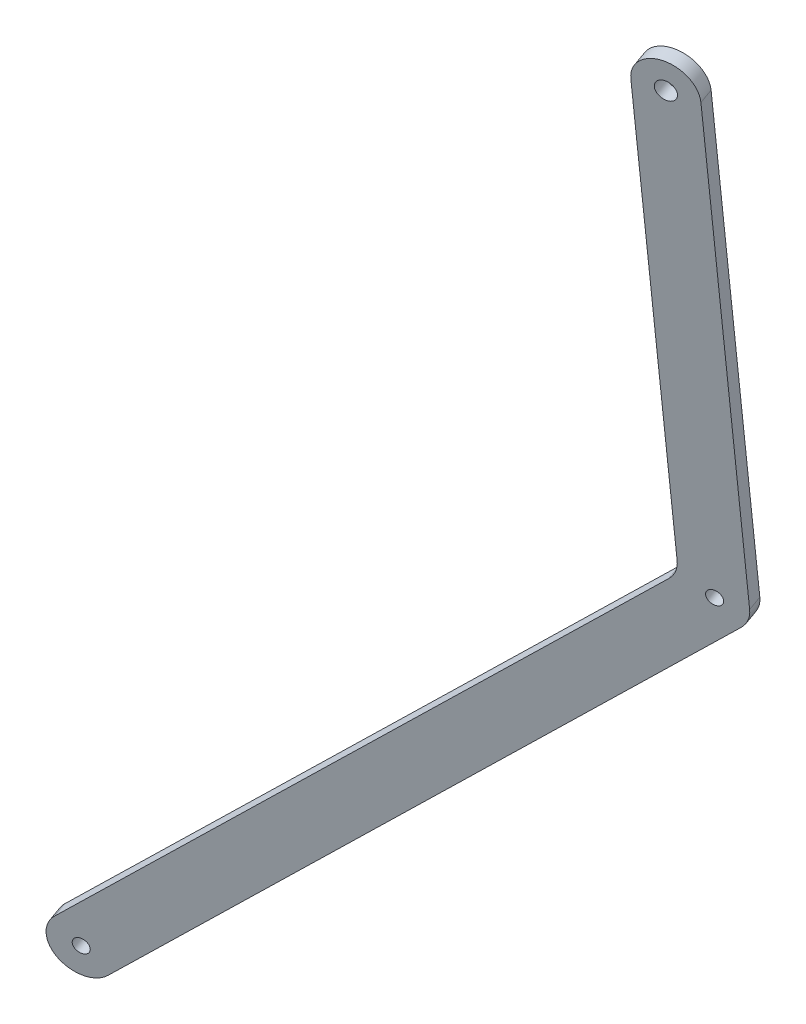
ISO-10303-21;
HEADER;
FILE_DESCRIPTION(('STEP AP214'),'2;1');
FILE_NAME('part.step','',(''),(''),'','','');
FILE_SCHEMA(('AUTOMOTIVE_DESIGN { 1 0 10303 214 1 1 1 1 }'));
ENDSEC;
DATA;
#1=APPLICATION_CONTEXT('core data for automotive mechanical design processes');
#2=APPLICATION_PROTOCOL_DEFINITION('international standard','automotive_design',2000,#1);
#3=PRODUCT_CONTEXT('',#1,'mechanical');
#4=PRODUCT('Part','Part','',(#3));
#5=PRODUCT_RELATED_PRODUCT_CATEGORY('part','',(#4));
#6=PRODUCT_DEFINITION_FORMATION('','',#4);
#7=PRODUCT_DEFINITION_CONTEXT('part definition',#1,'design');
#8=PRODUCT_DEFINITION('design','',#6,#7);
#9=PRODUCT_DEFINITION_SHAPE('','',#8);
#10=(LENGTH_UNIT() NAMED_UNIT(*) SI_UNIT(.MILLI.,.METRE.));
#11=(NAMED_UNIT(*) PLANE_ANGLE_UNIT() SI_UNIT($,.RADIAN.));
#12=(NAMED_UNIT(*) SI_UNIT($,.STERADIAN.) SOLID_ANGLE_UNIT());
#13=UNCERTAINTY_MEASURE_WITH_UNIT(LENGTH_MEASURE(1.E-05),#10,'distance_accuracy_value','');
#14=(GEOMETRIC_REPRESENTATION_CONTEXT(3) GLOBAL_UNCERTAINTY_ASSIGNED_CONTEXT((#13)) GLOBAL_UNIT_ASSIGNED_CONTEXT((#10,
#11,#12)) REPRESENTATION_CONTEXT('',''));
#15=CARTESIAN_POINT('',(0.,0.,0.));
#16=DIRECTION('',(0.,0.,1.));
#17=DIRECTION('',(1.,0.,0.));
#18=AXIS2_PLACEMENT_3D('',#15,#16,#17);
#19=CARTESIAN_POINT('',(251.457441225695,243.488406184557,-26.2901125618255));
#20=DIRECTION('',(-0.249568494194607,0.141259138504174,-0.95799865474566));
#21=DIRECTION('',(-0.967702138857663,0.,0.252096351521209));
#22=AXIS2_PLACEMENT_3D('',#19,#20,#21);
#23=CYLINDRICAL_SURFACE('',#22,12.7);
#24=CARTESIAN_POINT('',(249.872681287559,244.385401714059,-32.3734040194604));
#25=DIRECTION('',(0.249568494194607,-0.141259138504174,0.95799865474566));
#26=DIRECTION('',(0.967702138857663,0.,-0.252096351521209));
#27=AXIS2_PLACEMENT_3D('',#24,#25,#26);
#28=CIRCLE('',#27,12.7);
#29=CARTESIAN_POINT('',(258.178341640701,235.431737203272,-35.8573526308087));
#30=VERTEX_POINT('',#29);
#31=CARTESIAN_POINT('',(262.162197813638,244.377118237347,-35.5761707826267));
#32=VERTEX_POINT('',#31);
#33=EDGE_CURVE('E164',#30,#32,#28,.T.);
#34=ORIENTED_EDGE('',*,*,#33,.T.);
#35=DIRECTION('',(-0.249568494194607,0.141259138504174,-0.95799865474566));
#36=VECTOR('',#35,1.);
#37=CARTESIAN_POINT('',(263.746957751774,243.480122707846,-29.4928793249917));
#38=LINE('',#37,#36);
#39=CARTESIAN_POINT('',(263.746957751774,243.480122707846,-29.4928793249917));
#40=VERTEX_POINT('',#39);
#41=EDGE_CURVE('E11',#40,#32,#38,.T.);
#42=ORIENTED_EDGE('',*,*,#41,.F.);
#43=CARTESIAN_POINT('',(251.457441225695,243.488406184557,-26.2901125618255));
#44=DIRECTION('',(0.249568494194607,-0.141259138504174,0.95799865474566));
#45=DIRECTION('',(0.967702138857663,0.,-0.252096351521209));
#46=AXIS2_PLACEMENT_3D('',#43,#44,#45);
#47=CIRCLE('',#46,12.7);
#48=CARTESIAN_POINT('',(259.763101578837,234.53474167377,-29.7740611731738));
#49=VERTEX_POINT('',#48);
#50=EDGE_CURVE('E202',#49,#40,#47,.T.);
#51=ORIENTED_EDGE('',*,*,#50,.F.);
#52=DIRECTION('',(-0.249568494194607,0.141259138504174,-0.95799865474566));
#53=VECTOR('',#52,1.);
#54=CARTESIAN_POINT('',(259.763101578837,234.53474167377,-29.7740611731738));
#55=LINE('',#54,#53);
#56=EDGE_CURVE('E64',#49,#30,#55,.T.);
#57=ORIENTED_EDGE('',*,*,#56,.T.);
#58=EDGE_LOOP('',(#34,#42,#51,#57));
#59=FACE_BOUND('',#58,.T.);
#60=ADVANCED_FACE('F47',(#59),#23,.T.);
#61=CARTESIAN_POINT('',(254.809085922663,-0.619712105334759,-63.1575624654786));
#62=DIRECTION('',(-0.967678466620401,0.000652242260751251,0.25218635930443));
#63=DIRECTION('',(0.252186412947003,0.,0.967678672455337));
#64=AXIS2_PLACEMENT_3D('',#61,#62,#63);
#65=PLANE('',#64);
#66=DIRECTION('',(0.0362484750662158,0.989972439196714,0.136530647424972));
#67=VECTOR('',#66,1.);
#68=CARTESIAN_POINT('',(253.224325984527,0.277283424166745,-69.2408539231135));
#69=LINE('',#68,#67);
#70=CARTESIAN_POINT('',(269.949691164763,457.059273113038,-6.24441249198373));
#71=VERTEX_POINT('',#70);
#72=EDGE_CURVE('E167',#32,#71,#69,.T.);
#73=ORIENTED_EDGE('',*,*,#72,.T.);
#74=DIRECTION('',(-0.249568494194607,0.141259138504174,-0.95799865474566));
#75=VECTOR('',#74,1.);
#76=CARTESIAN_POINT('',(271.534451102898,456.162277583536,-0.161121034348791));
#77=LINE('',#76,#75);
#78=CARTESIAN_POINT('',(271.534451102898,456.162277583536,-0.161121034348791));
#79=VERTEX_POINT('',#78);
#80=EDGE_CURVE('E56',#79,#71,#77,.T.);
#81=ORIENTED_EDGE('',*,*,#80,.F.);
#82=DIRECTION('',(0.0362484750662158,0.989972439196714,0.136530647424972));
#83=VECTOR('',#82,1.);
#84=CARTESIAN_POINT('',(254.809085922663,-0.619712105334759,-63.1575624654786));
#85=LINE('',#84,#83);
#86=EDGE_CURVE('E103',#40,#79,#85,.T.);
#87=ORIENTED_EDGE('',*,*,#86,.F.);
#88=ORIENTED_EDGE('',*,*,#41,.T.);
#89=EDGE_LOOP('',(#73,#81,#87,#88));
#90=FACE_BOUND('',#89,.T.);
#91=ADVANCED_FACE('F240',(#90),#65,.F.);
#92=CARTESIAN_POINT('',(259.244934576819,456.170561060248,3.04164572881747));
#93=DIRECTION('',(-0.249568494194607,0.141259138504174,-0.95799865474566));
#94=DIRECTION('',(-0.967702138857663,0.,0.252096351521209));
#95=AXIS2_PLACEMENT_3D('',#92,#93,#94);
#96=CYLINDRICAL_SURFACE('',#95,12.7);
#97=CARTESIAN_POINT('',(257.660174638683,457.067556589749,-3.04164572881747));
#98=DIRECTION('',(0.249568494194607,-0.141259138504174,0.95799865474566));
#99=DIRECTION('',(0.967702138857663,0.,-0.252096351521209));
#100=AXIS2_PLACEMENT_3D('',#97,#98,#99);
#101=CIRCLE('',#100,12.7);
#102=CARTESIAN_POINT('',(245.370658112604,457.075840066461,0.16112103434879));
#103=VERTEX_POINT('',#102);
#104=EDGE_CURVE('E170',#71,#103,#101,.T.);
#105=ORIENTED_EDGE('',*,*,#104,.T.);
#106=DIRECTION('',(-0.249568494194607,0.141259138504174,-0.95799865474566));
#107=VECTOR('',#106,1.);
#108=CARTESIAN_POINT('',(246.95541805074,456.178844536959,6.24441249198373));
#109=LINE('',#108,#107);
#110=CARTESIAN_POINT('',(246.95541805074,456.178844536959,6.24441249198373));
#111=VERTEX_POINT('',#110);
#112=EDGE_CURVE('E212',#111,#103,#109,.T.);
#113=ORIENTED_EDGE('',*,*,#112,.F.);
#114=CARTESIAN_POINT('',(259.244934576819,456.170561060248,3.04164572881747));
#115=DIRECTION('',(0.249568494194607,-0.141259138504174,0.95799865474566));
#116=DIRECTION('',(0.967702138857663,0.,-0.252096351521209));
#117=AXIS2_PLACEMENT_3D('',#114,#115,#116);
#118=CIRCLE('',#117,12.7);
#119=EDGE_CURVE('E222',#79,#111,#118,.T.);
#120=ORIENTED_EDGE('',*,*,#119,.F.);
#121=ORIENTED_EDGE('',*,*,#80,.T.);
#122=EDGE_LOOP('',(#105,#113,#120,#121));
#123=FACE_BOUND('',#122,.T.);
#124=ADVANCED_FACE('F220',(#123),#96,.T.);
#125=CARTESIAN_POINT('',(230.230052870505,-0.603145151911553,-56.7520289391461));
#126=DIRECTION('',(0.967678466620401,-0.000652242260750718,-0.25218635930443));
#127=DIRECTION('',(-0.252186412947003,0.,-0.967678672455337));
#128=AXIS2_PLACEMENT_3D('',#125,#126,#127);
#129=PLANE('',#128);
#130=DIRECTION('',(-0.0362484750662153,-0.989972439196714,-0.136530647424972));
#131=VECTOR('',#130,1.);
#132=CARTESIAN_POINT('',(228.645292932369,0.293850377589952,-62.835320396781));
#133=LINE('',#132,#131);
#134=CARTESIAN_POINT('',(237.968048830002,254.905151381452,-27.7209632779317));
#135=VERTEX_POINT('',#134);
#136=EDGE_CURVE('E173',#103,#135,#133,.T.);
#137=ORIENTED_EDGE('',*,*,#136,.T.);
#138=DIRECTION('',(-0.249568494194607,0.141259138504174,-0.95799865474566));
#139=VECTOR('',#138,1.);
#140=CARTESIAN_POINT('',(239.552808768138,254.008155851951,-21.6376718202967));
#141=LINE('',#140,#139);
#142=CARTESIAN_POINT('',(239.552808768138,254.008155851951,-21.6376718202967));
#143=VERTEX_POINT('',#142);
#144=EDGE_CURVE('E209',#143,#135,#141,.T.);
#145=ORIENTED_EDGE('',*,*,#144,.F.);
#146=DIRECTION('',(-0.0362484750662153,-0.989972439196714,-0.136530647424972));
#147=VECTOR('',#146,1.);
#148=CARTESIAN_POINT('',(230.230052870505,-0.603145151911553,-56.7520289391461));
#149=LINE('',#148,#147);
#150=EDGE_CURVE('E146',#111,#143,#149,.T.);
#151=ORIENTED_EDGE('',*,*,#150,.F.);
#152=ORIENTED_EDGE('',*,*,#112,.T.);
#153=EDGE_LOOP('',(#137,#145,#151,#152));
#154=FACE_BOUND('',#153,.T.);
#155=ADVANCED_FACE('F230',(#154),#129,.F.);
#156=CARTESIAN_POINT('',(227.263292242058,254.016439328662,-18.4349050571304));
#157=DIRECTION('',(-0.249568494194607,0.141259138504174,-0.95799865474566));
#158=DIRECTION('',(-0.967702138857663,0.,0.252096351521209));
#159=AXIS2_PLACEMENT_3D('',#156,#157,#158);
#160=CYLINDRICAL_SURFACE('',#159,12.7);
#161=CARTESIAN_POINT('',(225.678532303923,254.913434858164,-24.5181965147654));
#162=DIRECTION('',(0.249568494194607,-0.141259138504174,0.95799865474566));
#163=DIRECTION('',(0.967702138857663,0.,-0.252096351521209));
#164=AXIS2_PLACEMENT_3D('',#161,#162,#163);
#165=CIRCLE('',#164,12.7);
#166=CARTESIAN_POINT('',(233.984192657065,245.959770347377,-28.0021451261138));
#167=VERTEX_POINT('',#166);
#168=EDGE_CURVE('E177',#167,#135,#165,.T.);
#169=ORIENTED_EDGE('',*,*,#168,.F.);
#170=DIRECTION('',(-0.249568494194607,0.141259138504174,-0.95799865474566));
#171=VECTOR('',#170,1.);
#172=CARTESIAN_POINT('',(235.568952595201,245.062774817875,-21.9188536684788));
#173=LINE('',#172,#171);
#174=CARTESIAN_POINT('',(235.568952595201,245.062774817875,-21.9188536684788));
#175=VERTEX_POINT('',#174);
#176=EDGE_CURVE('E129',#175,#167,#173,.T.);
#177=ORIENTED_EDGE('',*,*,#176,.F.);
#178=CARTESIAN_POINT('',(227.263292242058,254.016439328662,-18.4349050571304));
#179=DIRECTION('',(0.249568494194607,-0.141259138504174,0.95799865474566));
#180=DIRECTION('',(0.967702138857663,0.,-0.252096351521209));
#181=AXIS2_PLACEMENT_3D('',#178,#179,#180);
#182=CIRCLE('',#181,12.7);
#183=EDGE_CURVE('E142',#175,#143,#182,.T.);
#184=ORIENTED_EDGE('',*,*,#183,.T.);
#185=ORIENTED_EDGE('',*,*,#144,.T.);
#186=EDGE_LOOP('',(#169,#177,#184,#185));
#187=FACE_BOUND('',#186,.T.);
#188=ADVANCED_FACE('F250',(#187),#160,.F.);
#189=CARTESIAN_POINT('',(-7.5132803840742,8.50516674603631,6.52559434016577));
#190=DIRECTION('',(-0.653989004184416,0.705012953605281,0.274326662310891));
#191=DIRECTION('',(-0.73313867168736,-0.680079177799537,0.));
#192=AXIS2_PLACEMENT_3D('',#189,#190,#191);
#193=PLANE('',#192);
#194=DIRECTION('',(0.714152609118886,0.694983878257487,-0.0835670978966692));
#195=VECTOR('',#194,1.);
#196=CARTESIAN_POINT('',(-9.09804032220996,9.40216227553781,0.442302882530827));
#197=LINE('',#196,#195);
#198=CARTESIAN_POINT('',(-9.09804032220996,9.40216227553782,0.442302882530827));
#199=VERTEX_POINT('',#198);
#200=EDGE_CURVE('E125',#199,#167,#197,.T.);
#201=ORIENTED_EDGE('',*,*,#200,.F.);
#202=DIRECTION('',(-0.249568494194607,0.141259138504174,-0.95799865474566));
#203=VECTOR('',#202,1.);
#204=CARTESIAN_POINT('',(-7.5132803840742,8.50516674603631,6.52559434016577));
#205=LINE('',#204,#203);
#206=CARTESIAN_POINT('',(-7.5132803840742,8.50516674603631,6.52559434016577));
#207=VERTEX_POINT('',#206);
#208=EDGE_CURVE('E119',#207,#199,#205,.T.);
#209=ORIENTED_EDGE('',*,*,#208,.F.);
#210=DIRECTION('',(0.714152609118886,0.694983878257487,-0.0835670978966692));
#211=VECTOR('',#210,1.);
#212=CARTESIAN_POINT('',(-7.5132803840742,8.50516674603631,6.52559434016577));
#213=LINE('',#212,#211);
#214=EDGE_CURVE('E123',#207,#175,#213,.T.);
#215=ORIENTED_EDGE('',*,*,#214,.T.);
#216=ORIENTED_EDGE('',*,*,#176,.T.);
#217=EDGE_LOOP('',(#201,#209,#215,#216));
#218=FACE_BOUND('',#217,.T.);
#219=ADVANCED_FACE('F121',(#218),#193,.T.);
#220=CARTESIAN_POINT('',(0.792379969067892,-0.448497764750752,3.04164572881747));
#221=DIRECTION('',(-0.249568494194607,0.141259138504174,-0.95799865474566));
#222=DIRECTION('',(-0.967702138857663,0.,0.252096351521209));
#223=AXIS2_PLACEMENT_3D('',#220,#221,#222);
#224=CYLINDRICAL_SURFACE('',#223,12.7);
#225=CARTESIAN_POINT('',(-0.792379969067864,0.448497764750752,-3.04164572881747));
#226=DIRECTION('',(0.249568494194607,-0.141259138504174,0.95799865474566));
#227=DIRECTION('',(0.967702138857663,0.,-0.252096351521209));
#228=AXIS2_PLACEMENT_3D('',#225,#226,#227);
#229=CIRCLE('',#228,12.7);
#230=CARTESIAN_POINT('',(7.51328038407422,-8.50516674603632,-6.52559434016581));
#231=VERTEX_POINT('',#230);
#232=EDGE_CURVE('E183',#199,#231,#229,.T.);
#233=ORIENTED_EDGE('',*,*,#232,.T.);
#234=DIRECTION('',(-0.249568494194607,0.141259138504174,-0.95799865474566));
#235=VECTOR('',#234,1.);
#236=CARTESIAN_POINT('',(9.09804032220998,-9.40216227553782,-0.442302882530864));
#237=LINE('',#236,#235);
#238=CARTESIAN_POINT('',(9.09804032220998,-9.40216227553782,-0.442302882530864));
#239=VERTEX_POINT('',#238);
#240=EDGE_CURVE('E91',#239,#231,#237,.T.);
#241=ORIENTED_EDGE('',*,*,#240,.F.);
#242=CARTESIAN_POINT('',(0.792379969067892,-0.448497764750752,3.04164572881747));
#243=DIRECTION('',(0.249568494194607,-0.141259138504174,0.95799865474566));
#244=DIRECTION('',(0.967702138857663,0.,-0.252096351521209));
#245=AXIS2_PLACEMENT_3D('',#242,#243,#244);
#246=CIRCLE('',#245,12.7);
#247=EDGE_CURVE('E131',#207,#239,#246,.T.);
#248=ORIENTED_EDGE('',*,*,#247,.F.);
#249=ORIENTED_EDGE('',*,*,#208,.T.);
#250=EDGE_LOOP('',(#233,#241,#248,#249));
#251=FACE_BOUND('',#250,.T.);
#252=ADVANCED_FACE('F132',(#251),#224,.T.);
#253=CARTESIAN_POINT('',(251.457441225695,243.488406184557,-26.2901125618255));
#254=DIRECTION('',(-0.249568494194607,0.141259138504174,-0.95799865474566));
#255=DIRECTION('',(-0.967702138857663,0.,0.252096351521209));
#256=AXIS2_PLACEMENT_3D('',#253,#254,#255);
#257=CYLINDRICAL_SURFACE('',#256,3.26389999999998);
#258=CARTESIAN_POINT('',(251.457441225695,243.488406184557,-26.2901125618255));
#259=DIRECTION('',(0.249568494194607,-0.141259138504174,0.95799865474566));
#260=DIRECTION('',(0.967702138857663,0.,-0.252096351521209));
#261=AXIS2_PLACEMENT_3D('',#258,#259,#260);
#262=CIRCLE('',#261,3.26389999999998);
#263=CARTESIAN_POINT('',(254.615924236713,243.488406184557,-27.1129298435555));
#264=VERTEX_POINT('',#263);
#265=EDGE_CURVE('E156',#264,#264,#262,.T.);
#266=ORIENTED_EDGE('',*,*,#265,.T.);
#267=EDGE_LOOP('',(#266));
#268=FACE_BOUND('',#267,.T.);
#269=CARTESIAN_POINT('',(249.872681287559,244.385401714059,-32.3734040194604));
#270=DIRECTION('',(0.249568494194607,-0.141259138504174,0.95799865474566));
#271=DIRECTION('',(0.967702138857663,0.,-0.252096351521209));
#272=AXIS2_PLACEMENT_3D('',#269,#270,#271);
#273=CIRCLE('',#272,3.26389999999998);
#274=CARTESIAN_POINT('',(253.031164298577,244.385401714059,-33.1962213011905));
#275=VERTEX_POINT('',#274);
#276=EDGE_CURVE('E194',#275,#275,#273,.T.);
#277=ORIENTED_EDGE('',*,*,#276,.F.);
#278=EDGE_LOOP('',(#277));
#279=FACE_BOUND('',#278,.T.);
#280=ADVANCED_FACE('F258',(#268,#279),#257,.F.);
#281=CARTESIAN_POINT('',(0.792379969067892,-0.448497764750752,3.04164572881747));
#282=DIRECTION('',(-0.249568494194607,0.141259138504174,-0.95799865474566));
#283=DIRECTION('',(-0.967702138857663,0.,0.252096351521209));
#284=AXIS2_PLACEMENT_3D('',#281,#282,#283);
#285=CYLINDRICAL_SURFACE('',#284,3.2639);
#286=CARTESIAN_POINT('',(0.792379969067892,-0.448497764750752,3.04164572881747));
#287=DIRECTION('',(0.249568494194607,-0.141259138504174,0.95799865474566));
#288=DIRECTION('',(0.967702138857663,0.,-0.252096351521209));
#289=AXIS2_PLACEMENT_3D('',#286,#287,#288);
#290=CIRCLE('',#289,3.2639);
#291=CARTESIAN_POINT('',(3.95086298008542,-0.448497764750752,2.2188284470874));
#292=VERTEX_POINT('',#291);
#293=EDGE_CURVE('E152',#292,#292,#290,.T.);
#294=ORIENTED_EDGE('',*,*,#293,.T.);
#295=EDGE_LOOP('',(#294));
#296=FACE_BOUND('',#295,.T.);
#297=CARTESIAN_POINT('',(-0.792379969067864,0.448497764750752,-3.04164572881747));
#298=DIRECTION('',(0.249568494194607,-0.141259138504174,0.95799865474566));
#299=DIRECTION('',(0.967702138857663,0.,-0.252096351521209));
#300=AXIS2_PLACEMENT_3D('',#297,#298,#299);
#301=CIRCLE('',#300,3.2639);
#302=CARTESIAN_POINT('',(2.36610304194966,0.448497764750752,-3.86446301054755));
#303=VERTEX_POINT('',#302);
#304=EDGE_CURVE('E190',#303,#303,#301,.T.);
#305=ORIENTED_EDGE('',*,*,#304,.F.);
#306=EDGE_LOOP('',(#305));
#307=FACE_BOUND('',#306,.T.);
#308=ADVANCED_FACE('F263',(#296,#307),#285,.F.);
#309=CARTESIAN_POINT('',(9.09804032220997,-9.40216227553783,-0.442302882530863));
#310=DIRECTION('',(0.653989004184416,-0.705012953605281,-0.274326662310891));
#311=DIRECTION('',(0.73313867168736,0.680079177799537,0.));
#312=AXIS2_PLACEMENT_3D('',#309,#310,#311);
#313=PLANE('',#312);
#314=DIRECTION('',(-0.714152609118886,-0.694983878257487,0.0835670978966692));
#315=VECTOR('',#314,1.);
#316=CARTESIAN_POINT('',(7.51328038407422,-8.50516674603633,-6.52559434016581));
#317=LINE('',#316,#315);
#318=EDGE_CURVE('E186',#30,#231,#317,.T.);
#319=ORIENTED_EDGE('',*,*,#318,.F.);
#320=ORIENTED_EDGE('',*,*,#56,.F.);
#321=DIRECTION('',(-0.714152609118886,-0.694983878257487,0.0835670978966692));
#322=VECTOR('',#321,1.);
#323=CARTESIAN_POINT('',(9.09804032220997,-9.40216227553783,-0.442302882530863));
#324=LINE('',#323,#322);
#325=EDGE_CURVE('E136',#49,#239,#324,.T.);
#326=ORIENTED_EDGE('',*,*,#325,.T.);
#327=ORIENTED_EDGE('',*,*,#240,.T.);
#328=EDGE_LOOP('',(#319,#320,#326,#327));
#329=FACE_BOUND('',#328,.T.);
#330=ADVANCED_FACE('F259',(#329),#313,.T.);
#331=CARTESIAN_POINT('',(259.244934576819,456.170561060248,3.04164572881747));
#332=DIRECTION('',(-0.249568494194607,0.141259138504174,-0.95799865474566));
#333=DIRECTION('',(-0.967702138857663,0.,0.252096351521209));
#334=AXIS2_PLACEMENT_3D('',#331,#332,#333);
#335=CYLINDRICAL_SURFACE('',#334,4.19988999999995);
#336=CARTESIAN_POINT('',(259.244934576819,456.170561060248,3.04164572881747));
#337=DIRECTION('',(0.249568494194607,-0.141259138504174,0.95799865474566));
#338=DIRECTION('',(0.967702138857663,0.,-0.252096351521209));
#339=AXIS2_PLACEMENT_3D('',#336,#337,#338);
#340=CIRCLE('',#339,4.19988999999995);
#341=CARTESIAN_POINT('',(263.309177112786,456.170561060248,1.98286878302707));
#342=VERTEX_POINT('',#341);
#343=EDGE_CURVE('E160',#342,#342,#340,.T.);
#344=ORIENTED_EDGE('',*,*,#343,.T.);
#345=EDGE_LOOP('',(#344));
#346=FACE_BOUND('',#345,.T.);
#347=CARTESIAN_POINT('',(257.660174638683,457.067556589749,-3.04164572881747));
#348=DIRECTION('',(0.249568494194607,-0.141259138504174,0.95799865474566));
#349=DIRECTION('',(0.967702138857663,0.,-0.252096351521209));
#350=AXIS2_PLACEMENT_3D('',#347,#348,#349);
#351=CIRCLE('',#350,4.19988999999995);
#352=CARTESIAN_POINT('',(261.72441717465,457.067556589749,-4.10042267460787));
#353=VERTEX_POINT('',#352);
#354=EDGE_CURVE('E198',#353,#353,#351,.T.);
#355=ORIENTED_EDGE('',*,*,#354,.F.);
#356=EDGE_LOOP('',(#355));
#357=FACE_BOUND('',#356,.T.);
#358=ADVANCED_FACE('F262',(#346,#357),#335,.F.);
#359=CARTESIAN_POINT('',(0.792379969067875,-0.44849776475075,3.04164572881746));
#360=DIRECTION('',(0.249568494194607,-0.141259138504174,0.95799865474566));
#361=DIRECTION('',(0.967702138857663,0.,-0.252096351521209));
#362=AXIS2_PLACEMENT_3D('',#359,#360,#361);
#363=PLANE('',#362);
#364=ORIENTED_EDGE('',*,*,#50,.T.);
#365=ORIENTED_EDGE('',*,*,#86,.T.);
#366=ORIENTED_EDGE('',*,*,#119,.T.);
#367=ORIENTED_EDGE('',*,*,#150,.T.);
#368=ORIENTED_EDGE('',*,*,#183,.F.);
#369=ORIENTED_EDGE('',*,*,#214,.F.);
#370=ORIENTED_EDGE('',*,*,#247,.T.);
#371=ORIENTED_EDGE('',*,*,#325,.F.);
#372=EDGE_LOOP('',(#364,#365,#366,#367,#368,#369,#370,#371));
#373=FACE_BOUND('',#372,.T.);
#374=ORIENTED_EDGE('',*,*,#293,.F.);
#375=EDGE_LOOP('',(#374));
#376=FACE_BOUND('',#375,.T.);
#377=ORIENTED_EDGE('',*,*,#265,.F.);
#378=EDGE_LOOP('',(#377));
#379=FACE_BOUND('',#378,.T.);
#380=ORIENTED_EDGE('',*,*,#343,.F.);
#381=EDGE_LOOP('',(#380));
#382=FACE_BOUND('',#381,.T.);
#383=ADVANCED_FACE('F139',(#373,#376,#379,#382),#363,.T.);
#384=CARTESIAN_POINT('',(-0.792379969067881,0.448497764750754,-3.04164572881748));
#385=DIRECTION('',(0.249568494194607,-0.141259138504174,0.95799865474566));
#386=DIRECTION('',(0.967702138857663,0.,-0.252096351521209));
#387=AXIS2_PLACEMENT_3D('',#384,#385,#386);
#388=PLANE('',#387);
#389=ORIENTED_EDGE('',*,*,#33,.F.);
#390=ORIENTED_EDGE('',*,*,#318,.T.);
#391=ORIENTED_EDGE('',*,*,#232,.F.);
#392=ORIENTED_EDGE('',*,*,#200,.T.);
#393=ORIENTED_EDGE('',*,*,#168,.T.);
#394=ORIENTED_EDGE('',*,*,#136,.F.);
#395=ORIENTED_EDGE('',*,*,#104,.F.);
#396=ORIENTED_EDGE('',*,*,#72,.F.);
#397=EDGE_LOOP('',(#389,#390,#391,#392,#393,#394,#395,#396));
#398=FACE_BOUND('',#397,.T.);
#399=ORIENTED_EDGE('',*,*,#304,.T.);
#400=EDGE_LOOP('',(#399));
#401=FACE_BOUND('',#400,.T.);
#402=ORIENTED_EDGE('',*,*,#276,.T.);
#403=EDGE_LOOP('',(#402));
#404=FACE_BOUND('',#403,.T.);
#405=ORIENTED_EDGE('',*,*,#354,.T.);
#406=EDGE_LOOP('',(#405));
#407=FACE_BOUND('',#406,.T.);
#408=ADVANCED_FACE('F225',(#398,#401,#404,#407),#388,.F.);
#409=CLOSED_SHELL('',(#60,#91,#124,#155,#188,#219,#252,#280,#308,#330,#358,#383,#408));
#410=MANIFOLD_SOLID_BREP('B2',#409);
#411=ADVANCED_BREP_SHAPE_REPRESENTATION('',(#18,#410),#14);
#412=SHAPE_DEFINITION_REPRESENTATION(#9,#411);
ENDSEC;
END-ISO-10303-21;
